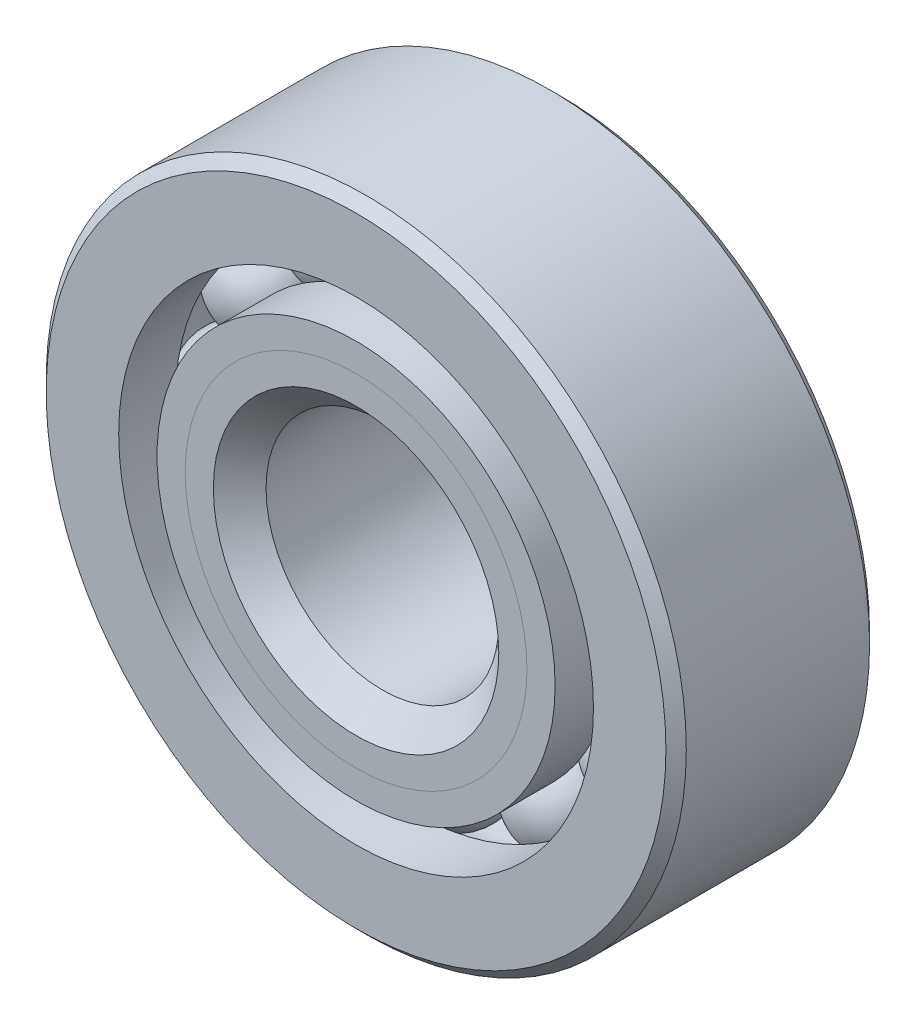
ISO-10303-21;
HEADER;
FILE_DESCRIPTION(('STEP AP214'),'2;1');
FILE_NAME('part.step','',(''),(''),'','','');
FILE_SCHEMA(('AUTOMOTIVE_DESIGN { 1 0 10303 214 1 1 1 1 }'));
ENDSEC;
DATA;
#1=APPLICATION_CONTEXT('core data for automotive mechanical design processes');
#2=APPLICATION_PROTOCOL_DEFINITION('international standard','automotive_design',2000,#1);
#3=PRODUCT_CONTEXT('',#1,'mechanical');
#4=PRODUCT('Part','Part','',(#3));
#5=PRODUCT_RELATED_PRODUCT_CATEGORY('part','',(#4));
#6=PRODUCT_DEFINITION_FORMATION('','',#4);
#7=PRODUCT_DEFINITION_CONTEXT('part definition',#1,'design');
#8=PRODUCT_DEFINITION('design','',#6,#7);
#9=PRODUCT_DEFINITION_SHAPE('','',#8);
#10=(LENGTH_UNIT() NAMED_UNIT(*) SI_UNIT(.MILLI.,.METRE.));
#11=(NAMED_UNIT(*) PLANE_ANGLE_UNIT() SI_UNIT($,.RADIAN.));
#12=(NAMED_UNIT(*) SI_UNIT($,.STERADIAN.) SOLID_ANGLE_UNIT());
#13=UNCERTAINTY_MEASURE_WITH_UNIT(LENGTH_MEASURE(1.E-05),#10,'distance_accuracy_value','');
#14=(GEOMETRIC_REPRESENTATION_CONTEXT(3) GLOBAL_UNCERTAINTY_ASSIGNED_CONTEXT((#13)) GLOBAL_UNIT_ASSIGNED_CONTEXT((#10,
#11,#12)) REPRESENTATION_CONTEXT('',''));
#15=CARTESIAN_POINT('',(0.,0.,0.));
#16=DIRECTION('',(0.,0.,1.));
#17=DIRECTION('',(1.,0.,0.));
#18=AXIS2_PLACEMENT_3D('',#15,#16,#17);
#19=CARTESIAN_POINT('',(-5.95312499999987,10.3111149638085,0.));
#20=DIRECTION('',(0.,0.,1.));
#21=DIRECTION('',(-0.499999999999989,0.866025403784445,0.));
#22=AXIS2_PLACEMENT_3D('',#19,#20,#21);
#23=SPHERICAL_SURFACE('',#22,2.68211551867683);
#24=CARTESIAN_POINT('',(-5.95312499999987,10.3111149638085,2.68211551867683));
#25=VERTEX_POINT('',#24);
#26=VERTEX_LOOP('',#25);
#27=FACE_BOUND('',#26,.T.);
#28=ADVANCED_FACE('F41',(#27),#23,.T.);
#29=CLOSED_SHELL('',(#28));
#30=MANIFOLD_SOLID_BREP('B2',#29);
#31=CARTESIAN_POINT('',(-10.3111149638084,5.95312500000012,0.));
#32=DIRECTION('',(0.,0.,1.));
#33=DIRECTION('',(-0.866025403784433,0.50000000000001,0.));
#34=AXIS2_PLACEMENT_3D('',#31,#32,#33);
#35=SPHERICAL_SURFACE('',#34,2.68211551867683);
#36=CARTESIAN_POINT('',(-10.3111149638084,5.95312500000012,2.68211551867683));
#37=VERTEX_POINT('',#36);
#38=VERTEX_LOOP('',#37);
#39=FACE_BOUND('',#38,.T.);
#40=ADVANCED_FACE('F62',(#39),#35,.T.);
#41=CLOSED_SHELL('',(#40));
#42=MANIFOLD_SOLID_BREP('B6',#41);
#43=CARTESIAN_POINT('',(-11.90625,1.24711421304626E-13,0.));
#44=DIRECTION('',(0.,0.,1.));
#45=DIRECTION('',(-1.,0.,0.));
#46=AXIS2_PLACEMENT_3D('',#43,#44,#45);
#47=SPHERICAL_SURFACE('',#46,2.68211551867683);
#48=CARTESIAN_POINT('',(-11.90625,1.24711421304626E-13,2.68211551867683));
#49=VERTEX_POINT('',#48);
#50=VERTEX_LOOP('',#49);
#51=FACE_BOUND('',#50,.T.);
#52=ADVANCED_FACE('F83',(#51),#47,.T.);
#53=CLOSED_SHELL('',(#52));
#54=MANIFOLD_SOLID_BREP('B37',#53);
#55=CARTESIAN_POINT('',(-10.3111149638085,-5.9531249999999,0.));
#56=DIRECTION('',(0.,0.,1.));
#57=DIRECTION('',(-0.866025403784443,-0.499999999999992,0.));
#58=AXIS2_PLACEMENT_3D('',#55,#56,#57);
#59=SPHERICAL_SURFACE('',#58,2.68211551867683);
#60=CARTESIAN_POINT('',(-10.3111149638085,-5.9531249999999,2.68211551867683));
#61=VERTEX_POINT('',#60);
#62=VERTEX_LOOP('',#61);
#63=FACE_BOUND('',#62,.T.);
#64=ADVANCED_FACE('F104',(#63),#59,.T.);
#65=CLOSED_SHELL('',(#64));
#66=MANIFOLD_SOLID_BREP('B58',#65);
#67=CARTESIAN_POINT('',(-5.95312500000009,-10.3111149638084,0.));
#68=DIRECTION('',(0.,0.,1.));
#69=DIRECTION('',(-0.500000000000007,-0.866025403784435,0.));
#70=AXIS2_PLACEMENT_3D('',#67,#68,#69);
#71=SPHERICAL_SURFACE('',#70,2.68211551867683);
#72=CARTESIAN_POINT('',(-5.95312500000009,-10.3111149638084,2.68211551867683));
#73=VERTEX_POINT('',#72);
#74=VERTEX_LOOP('',#73);
#75=FACE_BOUND('',#74,.T.);
#76=ADVANCED_FACE('F125',(#75),#71,.T.);
#77=CLOSED_SHELL('',(#76));
#78=MANIFOLD_SOLID_BREP('B79',#77);
#79=CARTESIAN_POINT('',(0.,-11.90625,0.));
#80=DIRECTION('',(0.,0.,1.));
#81=DIRECTION('',(0.,-1.,0.));
#82=AXIS2_PLACEMENT_3D('',#79,#80,#81);
#83=SPHERICAL_SURFACE('',#82,2.68211551867683);
#84=CARTESIAN_POINT('',(0.,-11.90625,2.68211551867683));
#85=VERTEX_POINT('',#84);
#86=VERTEX_LOOP('',#85);
#87=FACE_BOUND('',#86,.T.);
#88=ADVANCED_FACE('F146',(#87),#83,.T.);
#89=CLOSED_SHELL('',(#88));
#90=MANIFOLD_SOLID_BREP('B100',#89);
#91=CARTESIAN_POINT('',(5.95312499999994,-10.3111149638085,0.));
#92=DIRECTION('',(0.,0.,1.));
#93=DIRECTION('',(0.499999999999995,-0.866025403784442,0.));
#94=AXIS2_PLACEMENT_3D('',#91,#92,#93);
#95=SPHERICAL_SURFACE('',#94,2.68211551867683);
#96=CARTESIAN_POINT('',(5.95312499999994,-10.3111149638085,2.68211551867683));
#97=VERTEX_POINT('',#96);
#98=VERTEX_LOOP('',#97);
#99=FACE_BOUND('',#98,.T.);
#100=ADVANCED_FACE('F167',(#99),#95,.T.);
#101=CLOSED_SHELL('',(#100));
#102=MANIFOLD_SOLID_BREP('B121',#101);
#103=CARTESIAN_POINT('',(10.3111149638084,-5.95312500000005,0.));
#104=DIRECTION('',(0.,0.,1.));
#105=DIRECTION('',(0.866025403784436,-0.500000000000004,0.));
#106=AXIS2_PLACEMENT_3D('',#103,#104,#105);
#107=SPHERICAL_SURFACE('',#106,2.68211551867683);
#108=CARTESIAN_POINT('',(10.3111149638084,-5.95312500000005,2.68211551867683));
#109=VERTEX_POINT('',#108);
#110=VERTEX_LOOP('',#109);
#111=FACE_BOUND('',#110,.T.);
#112=ADVANCED_FACE('F188',(#111),#107,.T.);
#113=CLOSED_SHELL('',(#112));
#114=MANIFOLD_SOLID_BREP('B142',#113);
#115=CARTESIAN_POINT('',(11.90625,0.,0.));
#116=DIRECTION('',(0.,0.,1.));
#117=DIRECTION('',(1.,0.,0.));
#118=AXIS2_PLACEMENT_3D('',#115,#116,#117);
#119=SPHERICAL_SURFACE('',#118,2.68211551867683);
#120=CARTESIAN_POINT('',(11.90625,0.,2.68211551867683));
#121=VERTEX_POINT('',#120);
#122=VERTEX_LOOP('',#121);
#123=FACE_BOUND('',#122,.T.);
#124=ADVANCED_FACE('F209',(#123),#119,.T.);
#125=CLOSED_SHELL('',(#124));
#126=MANIFOLD_SOLID_BREP('B163',#125);
#127=CARTESIAN_POINT('',(10.3111149638085,5.95312499999998,0.));
#128=DIRECTION('',(0.,0.,1.));
#129=DIRECTION('',(0.86602540378444,0.499999999999998,0.));
#130=AXIS2_PLACEMENT_3D('',#127,#128,#129);
#131=SPHERICAL_SURFACE('',#130,2.68211551867683);
#132=CARTESIAN_POINT('',(10.3111149638085,5.95312499999998,2.68211551867683));
#133=VERTEX_POINT('',#132);
#134=VERTEX_LOOP('',#133);
#135=FACE_BOUND('',#134,.T.);
#136=ADVANCED_FACE('F230',(#135),#131,.T.);
#137=CLOSED_SHELL('',(#136));
#138=MANIFOLD_SOLID_BREP('B184',#137);
#139=CARTESIAN_POINT('',(5.95312500000001,10.3111149638085,0.));
#140=DIRECTION('',(0.,0.,1.));
#141=DIRECTION('',(0.500000000000001,0.866025403784438,0.));
#142=AXIS2_PLACEMENT_3D('',#139,#140,#141);
#143=SPHERICAL_SURFACE('',#142,2.68211551867683);
#144=CARTESIAN_POINT('',(5.95312500000001,10.3111149638085,2.68211551867683));
#145=VERTEX_POINT('',#144);
#146=VERTEX_LOOP('',#145);
#147=FACE_BOUND('',#146,.T.);
#148=ADVANCED_FACE('F251',(#147),#143,.T.);
#149=CLOSED_SHELL('',(#148));
#150=MANIFOLD_SOLID_BREP('B205',#149);
#151=CARTESIAN_POINT('',(0.,11.90625,0.));
#152=DIRECTION('',(0.,0.,1.));
#153=DIRECTION('',(0.,1.,0.));
#154=AXIS2_PLACEMENT_3D('',#151,#152,#153);
#155=SPHERICAL_SURFACE('',#154,2.68211551867683);
#156=CARTESIAN_POINT('',(0.,11.90625,2.68211551867683));
#157=VERTEX_POINT('',#156);
#158=VERTEX_LOOP('',#157);
#159=FACE_BOUND('',#158,.T.);
#160=ADVANCED_FACE('F273',(#159),#155,.T.);
#161=CLOSED_SHELL('',(#160));
#162=MANIFOLD_SOLID_BREP('B226',#161);
#163=CARTESIAN_POINT('',(0.,9.32330697197915,5.55625));
#164=DIRECTION('',(0.,0.,-1.));
#165=DIRECTION('',(-1.,0.,0.));
#166=AXIS2_PLACEMENT_3D('',#163,#164,#165);
#167=PLANE('',#166);
#168=CARTESIAN_POINT('',(0.,0.,5.55625));
#169=DIRECTION('',(0.,0.,1.));
#170=DIRECTION('',(1.,0.,0.));
#171=AXIS2_PLACEMENT_3D('',#168,#169,#170);
#172=CIRCLE('',#171,7.78706724066159);
#173=CARTESIAN_POINT('',(7.78706724066159,0.,5.55625));
#174=VERTEX_POINT('',#173);
#175=EDGE_CURVE('E328',#174,#174,#172,.T.);
#176=ORIENTED_EDGE('',*,*,#175,.F.);
#177=EDGE_LOOP('',(#176));
#178=FACE_BOUND('',#177,.T.);
#179=CARTESIAN_POINT('',(0.,0.,5.55625));
#180=DIRECTION('',(0.,0.,1.));
#181=DIRECTION('',(1.,0.,0.));
#182=AXIS2_PLACEMENT_3D('',#179,#180,#181);
#183=CIRCLE('',#182,9.32330697197915);
#184=CARTESIAN_POINT('',(9.32330697197915,0.,5.55625));
#185=VERTEX_POINT('',#184);
#186=EDGE_CURVE('E272',#185,#185,#183,.T.);
#187=ORIENTED_EDGE('',*,*,#186,.T.);
#188=EDGE_LOOP('',(#187));
#189=FACE_BOUND('',#188,.T.);
#190=ADVANCED_FACE('F294',(#178,#189),#167,.F.);
#191=CARTESIAN_POINT('',(0.,0.,4.02001026868245));
#192=DIRECTION('',(0.,0.,1.));
#193=DIRECTION('',(1.,0.,0.));
#194=AXIS2_PLACEMENT_3D('',#191,#192,#193);
#195=CONICAL_SURFACE('',#194,7.78706724066159,0.785398163397451);
#196=ORIENTED_EDGE('',*,*,#186,.F.);
#197=EDGE_LOOP('',(#196));
#198=FACE_BOUND('',#197,.T.);
#199=CARTESIAN_POINT('',(0.,0.,4.02001026868245));
#200=DIRECTION('',(0.,0.,1.));
#201=DIRECTION('',(1.,0.,0.));
#202=AXIS2_PLACEMENT_3D('',#199,#200,#201);
#203=CIRCLE('',#202,7.78706724066159);
#204=CARTESIAN_POINT('',(7.78706724066159,0.,4.02001026868245));
#205=VERTEX_POINT('',#204);
#206=EDGE_CURVE('E300',#205,#205,#203,.T.);
#207=ORIENTED_EDGE('',*,*,#206,.T.);
#208=EDGE_LOOP('',(#207));
#209=FACE_BOUND('',#208,.T.);
#210=ADVANCED_FACE('F335',(#198,#209),#195,.T.);
#211=CARTESIAN_POINT('',(0.,0.,5.55625));
#212=DIRECTION('',(0.,0.,1.));
#213=DIRECTION('',(1.,0.,0.));
#214=AXIS2_PLACEMENT_3D('',#211,#212,#213);
#215=CYLINDRICAL_SURFACE('',#214,7.78706724066159);
#216=ORIENTED_EDGE('',*,*,#206,.F.);
#217=EDGE_LOOP('',(#216));
#218=FACE_BOUND('',#217,.T.);
#219=CARTESIAN_POINT('',(0.,0.,0.));
#220=DIRECTION('',(0.,0.,1.));
#221=DIRECTION('',(1.,0.,0.));
#222=AXIS2_PLACEMENT_3D('',#219,#220,#221);
#223=CIRCLE('',#222,7.78706724066159);
#224=CARTESIAN_POINT('',(7.78706724066159,0.,0.));
#225=VERTEX_POINT('',#224);
#226=EDGE_CURVE('E304',#225,#225,#223,.T.);
#227=ORIENTED_EDGE('',*,*,#226,.T.);
#228=EDGE_LOOP('',(#227));
#229=FACE_BOUND('',#228,.T.);
#230=ADVANCED_FACE('F339',(#218,#229),#215,.T.);
#231=CARTESIAN_POINT('',(0.,7.78706724066159,0.));
#232=DIRECTION('',(0.,0.,-1.));
#233=DIRECTION('',(-1.,0.,0.));
#234=AXIS2_PLACEMENT_3D('',#231,#232,#233);
#235=PLANE('',#234);
#236=ORIENTED_EDGE('',*,*,#226,.F.);
#237=EDGE_LOOP('',(#236));
#238=FACE_BOUND('',#237,.T.);
#239=CARTESIAN_POINT('',(0.,0.,0.));
#240=DIRECTION('',(0.,0.,1.));
#241=DIRECTION('',(1.,0.,0.));
#242=AXIS2_PLACEMENT_3D('',#239,#240,#241);
#243=CIRCLE('',#242,9.22413448132317);
#244=CARTESIAN_POINT('',(9.22413448132317,0.,0.));
#245=VERTEX_POINT('',#244);
#246=EDGE_CURVE('E308',#245,#245,#243,.T.);
#247=ORIENTED_EDGE('',*,*,#246,.T.);
#248=EDGE_LOOP('',(#247));
#249=FACE_BOUND('',#248,.T.);
#250=ADVANCED_FACE('F344',(#238,#249),#235,.F.);
#251=CARTESIAN_POINT('',(0.,0.,0.));
#252=DIRECTION('',(0.,0.,1.));
#253=DIRECTION('',(1.,0.,0.));
#254=AXIS2_PLACEMENT_3D('',#251,#252,#253);
#255=TOROIDAL_SURFACE('',#254,11.90625,2.68211551867683);
#256=ORIENTED_EDGE('',*,*,#246,.F.);
#257=EDGE_LOOP('',(#256));
#258=FACE_BOUND('',#257,.T.);
#259=CARTESIAN_POINT('',(0.,0.,-2.46944444444444));
#260=DIRECTION('',(0.,0.,1.));
#261=DIRECTION('',(1.,0.,0.));
#262=AXIS2_PLACEMENT_3D('',#259,#260,#261);
#263=CIRCLE('',#262,10.8595467032967);
#264=CARTESIAN_POINT('',(10.8595467032967,0.,-2.46944444444444));
#265=VERTEX_POINT('',#264);
#266=EDGE_CURVE('E313',#265,#265,#263,.T.);
#267=ORIENTED_EDGE('',*,*,#266,.T.);
#268=EDGE_LOOP('',(#267));
#269=FACE_BOUND('',#268,.T.);
#270=ADVANCED_FACE('F350',(#258,#269),#255,.F.);
#271=CARTESIAN_POINT('',(0.,0.,5.55625));
#272=DIRECTION('',(0.,0.,1.));
#273=DIRECTION('',(1.,0.,0.));
#274=AXIS2_PLACEMENT_3D('',#271,#272,#273);
#275=CYLINDRICAL_SURFACE('',#274,10.8595467032967);
#276=ORIENTED_EDGE('',*,*,#266,.F.);
#277=EDGE_LOOP('',(#276));
#278=FACE_BOUND('',#277,.T.);
#279=CARTESIAN_POINT('',(0.,0.,-5.55625));
#280=DIRECTION('',(0.,0.,1.));
#281=DIRECTION('',(1.,0.,0.));
#282=AXIS2_PLACEMENT_3D('',#279,#280,#281);
#283=CIRCLE('',#282,10.8595467032967);
#284=CARTESIAN_POINT('',(10.8595467032967,0.,-5.55625));
#285=VERTEX_POINT('',#284);
#286=EDGE_CURVE('E316',#285,#285,#283,.T.);
#287=ORIENTED_EDGE('',*,*,#286,.T.);
#288=EDGE_LOOP('',(#287));
#289=FACE_BOUND('',#288,.T.);
#290=ADVANCED_FACE('F354',(#278,#289),#275,.T.);
#291=CARTESIAN_POINT('',(0.,6.905625,-5.55625));
#292=DIRECTION('',(0.,0.,1.));
#293=DIRECTION('',(1.,0.,0.));
#294=AXIS2_PLACEMENT_3D('',#291,#292,#293);
#295=PLANE('',#294);
#296=ORIENTED_EDGE('',*,*,#286,.F.);
#297=EDGE_LOOP('',(#296));
#298=FACE_BOUND('',#297,.T.);
#299=CARTESIAN_POINT('',(0.,0.,-5.55625));
#300=DIRECTION('',(0.,0.,1.));
#301=DIRECTION('',(1.,0.,0.));
#302=AXIS2_PLACEMENT_3D('',#299,#300,#301);
#303=CIRCLE('',#302,6.905625);
#304=CARTESIAN_POINT('',(6.905625,0.,-5.55625));
#305=VERTEX_POINT('',#304);
#306=EDGE_CURVE('E319',#305,#305,#303,.T.);
#307=ORIENTED_EDGE('',*,*,#306,.T.);
#308=EDGE_LOOP('',(#307));
#309=FACE_BOUND('',#308,.T.);
#310=ADVANCED_FACE('F358',(#298,#309),#295,.F.);
#311=CARTESIAN_POINT('',(0.,0.,-5.000625));
#312=DIRECTION('',(0.,0.,-1.));
#313=DIRECTION('',(-1.,0.,0.));
#314=AXIS2_PLACEMENT_3D('',#311,#312,#313);
#315=CONICAL_SURFACE('',#314,6.35,0.78539816339745);
#316=ORIENTED_EDGE('',*,*,#306,.F.);
#317=EDGE_LOOP('',(#316));
#318=FACE_BOUND('',#317,.T.);
#319=CARTESIAN_POINT('',(0.,0.,-5.000625));
#320=DIRECTION('',(0.,0.,1.));
#321=DIRECTION('',(1.,0.,0.));
#322=AXIS2_PLACEMENT_3D('',#319,#320,#321);
#323=CIRCLE('',#322,6.35);
#324=CARTESIAN_POINT('',(6.35,0.,-5.000625));
#325=VERTEX_POINT('',#324);
#326=EDGE_CURVE('E322',#325,#325,#323,.T.);
#327=ORIENTED_EDGE('',*,*,#326,.T.);
#328=EDGE_LOOP('',(#327));
#329=FACE_BOUND('',#328,.T.);
#330=ADVANCED_FACE('F362',(#318,#329),#315,.F.);
#331=CARTESIAN_POINT('',(0.,0.,5.55625));
#332=DIRECTION('',(0.,0.,1.));
#333=DIRECTION('',(1.,0.,0.));
#334=AXIS2_PLACEMENT_3D('',#331,#332,#333);
#335=CYLINDRICAL_SURFACE('',#334,6.35);
#336=ORIENTED_EDGE('',*,*,#326,.F.);
#337=EDGE_LOOP('',(#336));
#338=FACE_BOUND('',#337,.T.);
#339=CARTESIAN_POINT('',(0.,0.,4.11918275933842));
#340=DIRECTION('',(0.,0.,1.));
#341=DIRECTION('',(1.,0.,0.));
#342=AXIS2_PLACEMENT_3D('',#339,#340,#341);
#343=CIRCLE('',#342,6.35);
#344=CARTESIAN_POINT('',(6.35,0.,4.11918275933842));
#345=VERTEX_POINT('',#344);
#346=EDGE_CURVE('E325',#345,#345,#343,.T.);
#347=ORIENTED_EDGE('',*,*,#346,.T.);
#348=EDGE_LOOP('',(#347));
#349=FACE_BOUND('',#348,.T.);
#350=ADVANCED_FACE('F366',(#338,#349),#335,.F.);
#351=CARTESIAN_POINT('',(0.,0.,5.55625));
#352=DIRECTION('',(0.,0.,1.));
#353=DIRECTION('',(1.,0.,0.));
#354=AXIS2_PLACEMENT_3D('',#351,#352,#353);
#355=CONICAL_SURFACE('',#354,7.78706724066159,0.78539816339745);
#356=ORIENTED_EDGE('',*,*,#346,.F.);
#357=EDGE_LOOP('',(#356));
#358=FACE_BOUND('',#357,.T.);
#359=ORIENTED_EDGE('',*,*,#175,.T.);
#360=EDGE_LOOP('',(#359));
#361=FACE_BOUND('',#360,.T.);
#362=ADVANCED_FACE('F332',(#358,#361),#355,.F.);
#363=CLOSED_SHELL('',(#190,#210,#230,#250,#270,#290,#310,#330,#350,#362));
#364=MANIFOLD_SOLID_BREP('B247',#363);
#365=CARTESIAN_POINT('',(0.,10.8595467032967,5.55625));
#366=DIRECTION('',(0.,0.,-1.));
#367=DIRECTION('',(-1.,0.,0.));
#368=AXIS2_PLACEMENT_3D('',#365,#366,#367);
#369=PLANE('',#368);
#370=CARTESIAN_POINT('',(0.,0.,5.55625));
#371=DIRECTION('',(0.,0.,1.));
#372=DIRECTION('',(1.,0.,0.));
#373=AXIS2_PLACEMENT_3D('',#370,#371,#372);
#374=CIRCLE('',#373,9.32330697197915);
#375=CARTESIAN_POINT('',(9.32330697197915,0.,5.55625));
#376=VERTEX_POINT('',#375);
#377=EDGE_CURVE('E293',#376,#376,#374,.T.);
#378=ORIENTED_EDGE('',*,*,#377,.F.);
#379=EDGE_LOOP('',(#378));
#380=FACE_BOUND('',#379,.T.);
#381=CARTESIAN_POINT('',(0.,0.,5.55625));
#382=DIRECTION('',(0.,0.,1.));
#383=DIRECTION('',(1.,0.,0.));
#384=AXIS2_PLACEMENT_3D('',#381,#382,#383);
#385=CIRCLE('',#384,10.8595467032967);
#386=CARTESIAN_POINT('',(10.8595467032967,0.,5.55625));
#387=VERTEX_POINT('',#386);
#388=EDGE_CURVE('E475',#387,#387,#385,.T.);
#389=ORIENTED_EDGE('',*,*,#388,.T.);
#390=EDGE_LOOP('',(#389));
#391=FACE_BOUND('',#390,.T.);
#392=ADVANCED_FACE('F453',(#380,#391),#369,.F.);
#393=CARTESIAN_POINT('',(0.,0.,5.55625));
#394=DIRECTION('',(0.,0.,1.));
#395=DIRECTION('',(1.,0.,0.));
#396=AXIS2_PLACEMENT_3D('',#393,#394,#395);
#397=CONICAL_SURFACE('',#396,9.32330697197915,0.785398163397451);
#398=CARTESIAN_POINT('',(0.,0.,4.02001026868245));
#399=DIRECTION('',(0.,0.,1.));
#400=DIRECTION('',(1.,0.,0.));
#401=AXIS2_PLACEMENT_3D('',#398,#399,#400);
#402=CIRCLE('',#401,7.78706724066159);
#403=CARTESIAN_POINT('',(7.78706724066159,0.,4.02001026868245));
#404=VERTEX_POINT('',#403);
#405=EDGE_CURVE('E459',#404,#404,#402,.T.);
#406=ORIENTED_EDGE('',*,*,#405,.F.);
#407=EDGE_LOOP('',(#406));
#408=FACE_BOUND('',#407,.T.);
#409=ORIENTED_EDGE('',*,*,#377,.T.);
#410=EDGE_LOOP('',(#409));
#411=FACE_BOUND('',#410,.T.);
#412=ADVANCED_FACE('F500',(#408,#411),#397,.F.);
#413=CARTESIAN_POINT('',(0.,0.,5.55625));
#414=DIRECTION('',(0.,0.,1.));
#415=DIRECTION('',(1.,0.,0.));
#416=AXIS2_PLACEMENT_3D('',#413,#414,#415);
#417=CYLINDRICAL_SURFACE('',#416,7.78706724066159);
#418=CARTESIAN_POINT('',(0.,0.,0.));
#419=DIRECTION('',(0.,0.,1.));
#420=DIRECTION('',(1.,0.,0.));
#421=AXIS2_PLACEMENT_3D('',#418,#419,#420);
#422=CIRCLE('',#421,7.78706724066159);
#423=CARTESIAN_POINT('',(7.78706724066159,0.,0.));
#424=VERTEX_POINT('',#423);
#425=EDGE_CURVE('E463',#424,#424,#422,.T.);
#426=ORIENTED_EDGE('',*,*,#425,.F.);
#427=EDGE_LOOP('',(#426));
#428=FACE_BOUND('',#427,.T.);
#429=ORIENTED_EDGE('',*,*,#405,.T.);
#430=EDGE_LOOP('',(#429));
#431=FACE_BOUND('',#430,.T.);
#432=ADVANCED_FACE('F495',(#428,#431),#417,.F.);
#433=CARTESIAN_POINT('',(0.,7.78706724066159,0.));
#434=DIRECTION('',(0.,0.,1.));
#435=DIRECTION('',(1.,0.,0.));
#436=AXIS2_PLACEMENT_3D('',#433,#434,#435);
#437=PLANE('',#436);
#438=CARTESIAN_POINT('',(0.,0.,0.));
#439=DIRECTION('',(0.,0.,1.));
#440=DIRECTION('',(1.,0.,0.));
#441=AXIS2_PLACEMENT_3D('',#438,#439,#440);
#442=CIRCLE('',#441,9.22413448132317);
#443=CARTESIAN_POINT('',(9.22413448132317,0.,0.));
#444=VERTEX_POINT('',#443);
#445=EDGE_CURVE('E467',#444,#444,#442,.T.);
#446=ORIENTED_EDGE('',*,*,#445,.F.);
#447=EDGE_LOOP('',(#446));
#448=FACE_BOUND('',#447,.T.);
#449=ORIENTED_EDGE('',*,*,#425,.T.);
#450=EDGE_LOOP('',(#449));
#451=FACE_BOUND('',#450,.T.);
#452=ADVANCED_FACE('F489',(#448,#451),#437,.F.);
#453=CARTESIAN_POINT('',(0.,0.,0.));
#454=DIRECTION('',(0.,0.,1.));
#455=DIRECTION('',(1.,0.,0.));
#456=AXIS2_PLACEMENT_3D('',#453,#454,#455);
#457=TOROIDAL_SURFACE('',#456,11.90625,2.68211551867683);
#458=CARTESIAN_POINT('',(0.,0.,2.46944444444444));
#459=DIRECTION('',(0.,0.,1.));
#460=DIRECTION('',(1.,0.,0.));
#461=AXIS2_PLACEMENT_3D('',#458,#459,#460);
#462=CIRCLE('',#461,10.8595467032967);
#463=CARTESIAN_POINT('',(10.8595467032967,0.,2.46944444444444));
#464=VERTEX_POINT('',#463);
#465=EDGE_CURVE('E472',#464,#464,#462,.T.);
#466=ORIENTED_EDGE('',*,*,#465,.F.);
#467=EDGE_LOOP('',(#466));
#468=FACE_BOUND('',#467,.T.);
#469=ORIENTED_EDGE('',*,*,#445,.T.);
#470=EDGE_LOOP('',(#469));
#471=FACE_BOUND('',#470,.T.);
#472=ADVANCED_FACE('F483',(#468,#471),#457,.F.);
#473=CARTESIAN_POINT('',(0.,0.,5.55625));
#474=DIRECTION('',(0.,0.,1.));
#475=DIRECTION('',(1.,0.,0.));
#476=AXIS2_PLACEMENT_3D('',#473,#474,#475);
#477=CYLINDRICAL_SURFACE('',#476,10.8595467032967);
#478=ORIENTED_EDGE('',*,*,#388,.F.);
#479=EDGE_LOOP('',(#478));
#480=FACE_BOUND('',#479,.T.);
#481=ORIENTED_EDGE('',*,*,#465,.T.);
#482=EDGE_LOOP('',(#481));
#483=FACE_BOUND('',#482,.T.);
#484=ADVANCED_FACE('F480',(#480,#483),#477,.T.);
#485=CLOSED_SHELL('',(#392,#412,#432,#452,#472,#484));
#486=MANIFOLD_SOLID_BREP('B267',#485);
#487=CARTESIAN_POINT('',(0.,0.,5.000625));
#488=DIRECTION('',(0.,0.,-1.));
#489=DIRECTION('',(-1.,0.,0.));
#490=AXIS2_PLACEMENT_3D('',#487,#488,#489);
#491=CONICAL_SURFACE('',#490,17.4625,0.785398163397446);
#492=CARTESIAN_POINT('',(0.,0.,5.55625));
#493=DIRECTION('',(0.,0.,1.));
#494=DIRECTION('',(1.,0.,0.));
#495=AXIS2_PLACEMENT_3D('',#492,#493,#494);
#496=CIRCLE('',#495,16.906875);
#497=CARTESIAN_POINT('',(16.906875,0.,5.55625));
#498=VERTEX_POINT('',#497);
#499=EDGE_CURVE('E573',#498,#498,#496,.T.);
#500=ORIENTED_EDGE('',*,*,#499,.F.);
#501=EDGE_LOOP('',(#500));
#502=FACE_BOUND('',#501,.T.);
#503=CARTESIAN_POINT('',(0.,0.,5.000625));
#504=DIRECTION('',(0.,0.,1.));
#505=DIRECTION('',(1.,0.,0.));
#506=AXIS2_PLACEMENT_3D('',#503,#504,#505);
#507=CIRCLE('',#506,17.4625);
#508=CARTESIAN_POINT('',(17.4625,0.,5.000625));
#509=VERTEX_POINT('',#508);
#510=EDGE_CURVE('E452',#509,#509,#507,.T.);
#511=ORIENTED_EDGE('',*,*,#510,.T.);
#512=EDGE_LOOP('',(#511));
#513=FACE_BOUND('',#512,.T.);
#514=ADVANCED_FACE('F545',(#502,#513),#491,.T.);
#515=CARTESIAN_POINT('',(0.,0.,5.55625));
#516=DIRECTION('',(0.,0.,1.));
#517=DIRECTION('',(1.,0.,0.));
#518=AXIS2_PLACEMENT_3D('',#515,#516,#517);
#519=CYLINDRICAL_SURFACE('',#518,17.4625);
#520=ORIENTED_EDGE('',*,*,#510,.F.);
#521=EDGE_LOOP('',(#520));
#522=FACE_BOUND('',#521,.T.);
#523=CARTESIAN_POINT('',(0.,0.,-5.000625));
#524=DIRECTION('',(0.,0.,1.));
#525=DIRECTION('',(1.,0.,0.));
#526=AXIS2_PLACEMENT_3D('',#523,#524,#525);
#527=CIRCLE('',#526,17.4625);
#528=CARTESIAN_POINT('',(17.4625,0.,-5.000625));
#529=VERTEX_POINT('',#528);
#530=EDGE_CURVE('E551',#529,#529,#527,.T.);
#531=ORIENTED_EDGE('',*,*,#530,.T.);
#532=EDGE_LOOP('',(#531));
#533=FACE_BOUND('',#532,.T.);
#534=ADVANCED_FACE('F580',(#522,#533),#519,.T.);
#535=CARTESIAN_POINT('',(0.,0.,-5.55625));
#536=DIRECTION('',(0.,0.,1.));
#537=DIRECTION('',(1.,0.,0.));
#538=AXIS2_PLACEMENT_3D('',#535,#536,#537);
#539=CONICAL_SURFACE('',#538,16.906875,0.785398163397447);
#540=ORIENTED_EDGE('',*,*,#530,.F.);
#541=EDGE_LOOP('',(#540));
#542=FACE_BOUND('',#541,.T.);
#543=CARTESIAN_POINT('',(0.,0.,-5.55625));
#544=DIRECTION('',(0.,0.,1.));
#545=DIRECTION('',(1.,0.,0.));
#546=AXIS2_PLACEMENT_3D('',#543,#544,#545);
#547=CIRCLE('',#546,16.906875);
#548=CARTESIAN_POINT('',(16.906875,0.,-5.55625));
#549=VERTEX_POINT('',#548);
#550=EDGE_CURVE('E555',#549,#549,#547,.T.);
#551=ORIENTED_EDGE('',*,*,#550,.T.);
#552=EDGE_LOOP('',(#551));
#553=FACE_BOUND('',#552,.T.);
#554=ADVANCED_FACE('F584',(#542,#553),#539,.T.);
#555=CARTESIAN_POINT('',(0.,16.906875,-5.55625));
#556=DIRECTION('',(0.,0.,1.));
#557=DIRECTION('',(1.,0.,0.));
#558=AXIS2_PLACEMENT_3D('',#555,#556,#557);
#559=PLANE('',#558);
#560=ORIENTED_EDGE('',*,*,#550,.F.);
#561=EDGE_LOOP('',(#560));
#562=FACE_BOUND('',#561,.T.);
#563=CARTESIAN_POINT('',(0.,0.,-5.55625));
#564=DIRECTION('',(0.,0.,1.));
#565=DIRECTION('',(1.,0.,0.));
#566=AXIS2_PLACEMENT_3D('',#563,#564,#565);
#567=CIRCLE('',#566,12.9529532967033);
#568=CARTESIAN_POINT('',(12.9529532967033,0.,-5.55625));
#569=VERTEX_POINT('',#568);
#570=EDGE_CURVE('E559',#569,#569,#567,.T.);
#571=ORIENTED_EDGE('',*,*,#570,.T.);
#572=EDGE_LOOP('',(#571));
#573=FACE_BOUND('',#572,.T.);
#574=ADVANCED_FACE('F589',(#562,#573),#559,.F.);
#575=CARTESIAN_POINT('',(0.,0.,5.55625));
#576=DIRECTION('',(0.,0.,1.));
#577=DIRECTION('',(1.,0.,0.));
#578=AXIS2_PLACEMENT_3D('',#575,#576,#577);
#579=CYLINDRICAL_SURFACE('',#578,12.9529532967033);
#580=ORIENTED_EDGE('',*,*,#570,.F.);
#581=EDGE_LOOP('',(#580));
#582=FACE_BOUND('',#581,.T.);
#583=CARTESIAN_POINT('',(0.,0.,-2.46944444444445));
#584=DIRECTION('',(0.,0.,1.));
#585=DIRECTION('',(1.,0.,0.));
#586=AXIS2_PLACEMENT_3D('',#583,#584,#585);
#587=CIRCLE('',#586,12.9529532967033);
#588=CARTESIAN_POINT('',(12.9529532967033,0.,-2.46944444444445));
#589=VERTEX_POINT('',#588);
#590=EDGE_CURVE('E564',#589,#589,#587,.T.);
#591=ORIENTED_EDGE('',*,*,#590,.T.);
#592=EDGE_LOOP('',(#591));
#593=FACE_BOUND('',#592,.T.);
#594=ADVANCED_FACE('F595',(#582,#593),#579,.F.);
#595=CARTESIAN_POINT('',(0.,0.,0.));
#596=DIRECTION('',(0.,0.,1.));
#597=DIRECTION('',(1.,0.,0.));
#598=AXIS2_PLACEMENT_3D('',#595,#596,#597);
#599=TOROIDAL_SURFACE('',#598,11.90625,2.68211551867683);
#600=ORIENTED_EDGE('',*,*,#590,.F.);
#601=EDGE_LOOP('',(#600));
#602=FACE_BOUND('',#601,.T.);
#603=CARTESIAN_POINT('',(0.,0.,2.46944444444444));
#604=DIRECTION('',(0.,0.,1.));
#605=DIRECTION('',(1.,0.,0.));
#606=AXIS2_PLACEMENT_3D('',#603,#604,#605);
#607=CIRCLE('',#606,12.9529532967033);
#608=CARTESIAN_POINT('',(12.9529532967033,0.,2.46944444444444));
#609=VERTEX_POINT('',#608);
#610=EDGE_CURVE('E567',#609,#609,#607,.T.);
#611=ORIENTED_EDGE('',*,*,#610,.T.);
#612=EDGE_LOOP('',(#611));
#613=FACE_BOUND('',#612,.T.);
#614=ADVANCED_FACE('F599',(#602,#613),#599,.F.);
#615=CARTESIAN_POINT('',(0.,0.,5.55625));
#616=DIRECTION('',(0.,0.,1.));
#617=DIRECTION('',(1.,0.,0.));
#618=AXIS2_PLACEMENT_3D('',#615,#616,#617);
#619=CYLINDRICAL_SURFACE('',#618,12.9529532967033);
#620=ORIENTED_EDGE('',*,*,#610,.F.);
#621=EDGE_LOOP('',(#620));
#622=FACE_BOUND('',#621,.T.);
#623=CARTESIAN_POINT('',(0.,0.,5.55625));
#624=DIRECTION('',(0.,0.,1.));
#625=DIRECTION('',(1.,0.,0.));
#626=AXIS2_PLACEMENT_3D('',#623,#624,#625);
#627=CIRCLE('',#626,12.9529532967033);
#628=CARTESIAN_POINT('',(12.9529532967033,0.,5.55625));
#629=VERTEX_POINT('',#628);
#630=EDGE_CURVE('E570',#629,#629,#627,.T.);
#631=ORIENTED_EDGE('',*,*,#630,.T.);
#632=EDGE_LOOP('',(#631));
#633=FACE_BOUND('',#632,.T.);
#634=ADVANCED_FACE('F603',(#622,#633),#619,.F.);
#635=CARTESIAN_POINT('',(0.,16.906875,5.55625));
#636=DIRECTION('',(0.,0.,-1.));
#637=DIRECTION('',(-1.,0.,0.));
#638=AXIS2_PLACEMENT_3D('',#635,#636,#637);
#639=PLANE('',#638);
#640=ORIENTED_EDGE('',*,*,#630,.F.);
#641=EDGE_LOOP('',(#640));
#642=FACE_BOUND('',#641,.T.);
#643=ORIENTED_EDGE('',*,*,#499,.T.);
#644=EDGE_LOOP('',(#643));
#645=FACE_BOUND('',#644,.T.);
#646=ADVANCED_FACE('F577',(#642,#645),#639,.F.);
#647=CLOSED_SHELL('',(#514,#534,#554,#574,#594,#614,#634,#646));
#648=MANIFOLD_SOLID_BREP('B288',#647);
#649=ADVANCED_BREP_SHAPE_REPRESENTATION('',(#18,#30,#42,#54,#66,#78,#90,#102,#114,#126,#138,
#150,#162,#364,#486,#648),#14);
#650=SHAPE_DEFINITION_REPRESENTATION(#9,#649);
ENDSEC;
END-ISO-10303-21;
